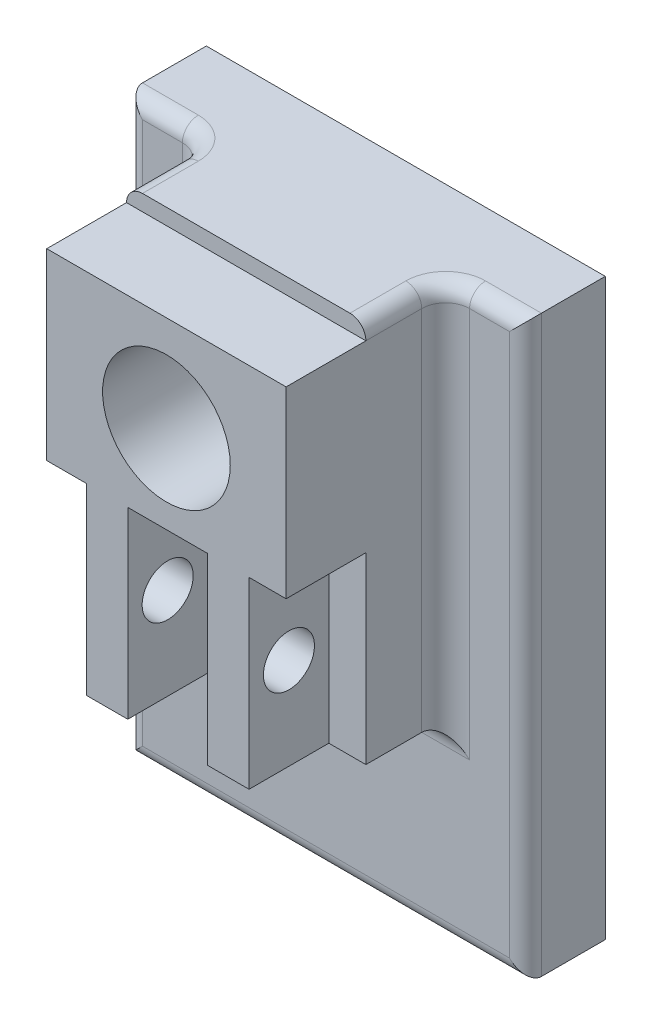
ISO-10303-21;
HEADER;
FILE_DESCRIPTION(('STEP AP214'),'2;1');
FILE_NAME('part.step','',(''),(''),'','','');
FILE_SCHEMA(('AUTOMOTIVE_DESIGN { 1 0 10303 214 1 1 1 1 }'));
ENDSEC;
DATA;
#1=APPLICATION_CONTEXT('core data for automotive mechanical design processes');
#2=APPLICATION_PROTOCOL_DEFINITION('international standard','automotive_design',2000,#1);
#3=PRODUCT_CONTEXT('',#1,'mechanical');
#4=PRODUCT('Part','Part','',(#3));
#5=PRODUCT_RELATED_PRODUCT_CATEGORY('part','',(#4));
#6=PRODUCT_DEFINITION_FORMATION('','',#4);
#7=PRODUCT_DEFINITION_CONTEXT('part definition',#1,'design');
#8=PRODUCT_DEFINITION('design','',#6,#7);
#9=PRODUCT_DEFINITION_SHAPE('','',#8);
#10=(LENGTH_UNIT() NAMED_UNIT(*) SI_UNIT(.MILLI.,.METRE.));
#11=(NAMED_UNIT(*) PLANE_ANGLE_UNIT() SI_UNIT($,.RADIAN.));
#12=(NAMED_UNIT(*) SI_UNIT($,.STERADIAN.) SOLID_ANGLE_UNIT());
#13=UNCERTAINTY_MEASURE_WITH_UNIT(LENGTH_MEASURE(1.E-05),#10,'distance_accuracy_value','');
#14=(GEOMETRIC_REPRESENTATION_CONTEXT(3) GLOBAL_UNCERTAINTY_ASSIGNED_CONTEXT((#13)) GLOBAL_UNIT_ASSIGNED_CONTEXT((#10,
#11,#12)) REPRESENTATION_CONTEXT('',''));
#15=CARTESIAN_POINT('',(0.,0.,0.));
#16=DIRECTION('',(0.,0.,1.));
#17=DIRECTION('',(1.,0.,0.));
#18=AXIS2_PLACEMENT_3D('',#15,#16,#17);
#19=CARTESIAN_POINT('',(-45.2947470817121,102.712840466926,50.));
#20=DIRECTION('',(0.,0.,1.));
#21=DIRECTION('',(1.,0.,0.));
#22=AXIS2_PLACEMENT_3D('',#19,#20,#21);
#23=PLANE('',#22);
#24=DIRECTION('',(1.,0.,0.));
#25=VECTOR('',#24,1.);
#26=CARTESIAN_POINT('',(-45.2947470817121,-17.2871595330739,50.));
#27=LINE('',#26,#25);
#28=CARTESIAN_POINT('',(-19.9070920345211,-17.2871595330739,50.));
#29=VERTEX_POINT('',#28);
#30=CARTESIAN_POINT('',(5.09290796547895,-17.2871595330739,50.));
#31=VERTEX_POINT('',#30);
#32=EDGE_CURVE('E238',#29,#31,#27,.T.);
#33=ORIENTED_EDGE('',*,*,#32,.T.);
#34=DIRECTION('',(0.,-1.,0.));
#35=VECTOR('',#34,1.);
#36=CARTESIAN_POINT('',(5.09290796547894,40.2128404669261,50.));
#37=LINE('',#36,#35);
#38=CARTESIAN_POINT('',(5.09290796547894,40.2128404669261,50.));
#39=VERTEX_POINT('',#38);
#40=EDGE_CURVE('E219',#39,#31,#37,.T.);
#41=ORIENTED_EDGE('',*,*,#40,.F.);
#42=DIRECTION('',(1.,0.,0.));
#43=VECTOR('',#42,1.);
#44=CARTESIAN_POINT('',(29.7052529182879,40.2128404669261,50.));
#45=LINE('',#44,#43);
#46=CARTESIAN_POINT('',(-19.9070920345211,40.2128404669261,50.));
#47=VERTEX_POINT('',#46);
#48=EDGE_CURVE('E467',#47,#39,#45,.T.);
#49=ORIENTED_EDGE('',*,*,#48,.F.);
#50=DIRECTION('',(0.,-1.,0.));
#51=VECTOR('',#50,1.);
#52=CARTESIAN_POINT('',(-19.9070920345211,40.2128404669261,50.));
#53=LINE('',#52,#51);
#54=EDGE_CURVE('E244',#47,#29,#53,.T.);
#55=ORIENTED_EDGE('',*,*,#54,.T.);
#56=EDGE_LOOP('',(#33,#41,#49,#55));
#57=FACE_BOUND('',#56,.T.);
#58=ADVANCED_FACE('F43',(#57),#23,.T.);
#59=CARTESIAN_POINT('',(29.7052529182879,40.2128404669261,75.));
#60=DIRECTION('',(0.,1.,0.));
#61=DIRECTION('',(-1.,0.,0.));
#62=AXIS2_PLACEMENT_3D('',#59,#60,#61);
#63=PLANE('',#62);
#64=DIRECTION('',(0.,0.,-1.));
#65=VECTOR('',#64,1.);
#66=CARTESIAN_POINT('',(5.09290796547894,40.2128404669261,75.));
#67=LINE('',#66,#65);
#68=CARTESIAN_POINT('',(5.09290796547894,40.2128404669261,75.));
#69=VERTEX_POINT('',#68);
#70=EDGE_CURVE('E225',#69,#39,#67,.T.);
#71=ORIENTED_EDGE('',*,*,#70,.F.);
#72=DIRECTION('',(1.,0.,0.));
#73=VECTOR('',#72,1.);
#74=CARTESIAN_POINT('',(29.7052529182879,40.2128404669261,75.));
#75=LINE('',#74,#73);
#76=CARTESIAN_POINT('',(-19.9070920345211,40.2128404669261,75.));
#77=VERTEX_POINT('',#76);
#78=EDGE_CURVE('E475',#77,#69,#75,.T.);
#79=ORIENTED_EDGE('',*,*,#78,.F.);
#80=DIRECTION('',(0.,0.,-1.));
#81=VECTOR('',#80,1.);
#82=CARTESIAN_POINT('',(-19.9070920345211,40.2128404669261,75.));
#83=LINE('',#82,#81);
#84=EDGE_CURVE('E498',#77,#47,#83,.T.);
#85=ORIENTED_EDGE('',*,*,#84,.T.);
#86=ORIENTED_EDGE('',*,*,#48,.T.);
#87=EDGE_LOOP('',(#71,#79,#85,#86));
#88=FACE_BOUND('',#87,.T.);
#89=ADVANCED_FACE('F569',(#88),#63,.F.);
#90=CARTESIAN_POINT('',(-45.2947470817121,-17.2871595330739,50.));
#91=VERTEX_POINT('',#90);
#92=CARTESIAN_POINT('',(-32.907092034521,-17.2871595330739,50.));
#93=VERTEX_POINT('',#92);
#94=EDGE_CURVE('E246',#91,#93,#27,.T.);
#95=ORIENTED_EDGE('',*,*,#94,.T.);
#96=DIRECTION('',(0.,-1.,0.));
#97=VECTOR('',#96,1.);
#98=CARTESIAN_POINT('',(-32.907092034521,40.2128404669261,50.));
#99=LINE('',#98,#97);
#100=CARTESIAN_POINT('',(-32.907092034521,40.2128404669261,50.));
#101=VERTEX_POINT('',#100);
#102=EDGE_CURVE('E507',#101,#93,#99,.T.);
#103=ORIENTED_EDGE('',*,*,#102,.F.);
#104=CARTESIAN_POINT('',(-45.2947470817121,40.2128404669261,50.));
#105=VERTEX_POINT('',#104);
#106=EDGE_CURVE('E462',#105,#101,#45,.T.);
#107=ORIENTED_EDGE('',*,*,#106,.F.);
#108=DIRECTION('',(0.,-1.,0.));
#109=VECTOR('',#108,1.);
#110=CARTESIAN_POINT('',(-45.2947470817121,102.712840466926,50.));
#111=LINE('',#110,#109);
#112=EDGE_CURVE('E253',#105,#91,#111,.T.);
#113=ORIENTED_EDGE('',*,*,#112,.T.);
#114=EDGE_LOOP('',(#95,#103,#107,#113));
#115=FACE_BOUND('',#114,.T.);
#116=ADVANCED_FACE('F571',(#115),#23,.T.);
#117=DIRECTION('',(0.,0.,-1.));
#118=VECTOR('',#117,1.);
#119=CARTESIAN_POINT('',(-32.907092034521,40.2128404669261,75.));
#120=LINE('',#119,#118);
#121=CARTESIAN_POINT('',(-32.907092034521,40.2128404669261,75.));
#122=VERTEX_POINT('',#121);
#123=EDGE_CURVE('E495',#122,#101,#120,.T.);
#124=ORIENTED_EDGE('',*,*,#123,.F.);
#125=CARTESIAN_POINT('',(-45.2947470817121,40.2128404669261,75.));
#126=VERTEX_POINT('',#125);
#127=EDGE_CURVE('E461',#126,#122,#75,.T.);
#128=ORIENTED_EDGE('',*,*,#127,.F.);
#129=DIRECTION('',(0.,0.,-1.));
#130=VECTOR('',#129,1.);
#131=CARTESIAN_POINT('',(-45.2947470817121,40.2128404669261,75.));
#132=LINE('',#131,#130);
#133=EDGE_CURVE('E451',#126,#105,#132,.T.);
#134=ORIENTED_EDGE('',*,*,#133,.T.);
#135=ORIENTED_EDGE('',*,*,#106,.T.);
#136=EDGE_LOOP('',(#124,#128,#134,#135));
#137=FACE_BOUND('',#136,.T.);
#138=ADVANCED_FACE('F578',(#137),#63,.F.);
#139=DIRECTION('',(0.,-1.,0.));
#140=VECTOR('',#139,1.);
#141=CARTESIAN_POINT('',(18.0929079654789,40.2128404669261,50.));
#142=LINE('',#141,#140);
#143=CARTESIAN_POINT('',(18.0929079654789,40.2128404669261,50.));
#144=VERTEX_POINT('',#143);
#145=CARTESIAN_POINT('',(18.0929079654789,-17.2871595330739,50.));
#146=VERTEX_POINT('',#145);
#147=EDGE_CURVE('E231',#144,#146,#142,.T.);
#148=ORIENTED_EDGE('',*,*,#147,.T.);
#149=CARTESIAN_POINT('',(29.7052529182879,-17.2871595330739,50.));
#150=VERTEX_POINT('',#149);
#151=EDGE_CURVE('E247',#146,#150,#27,.T.);
#152=ORIENTED_EDGE('',*,*,#151,.T.);
#153=DIRECTION('',(0.,1.,0.));
#154=VECTOR('',#153,1.);
#155=CARTESIAN_POINT('',(29.7052529182879,102.712840466926,50.));
#156=LINE('',#155,#154);
#157=CARTESIAN_POINT('',(29.7052529182879,40.2128404669261,50.));
#158=VERTEX_POINT('',#157);
#159=EDGE_CURVE('E252',#150,#158,#156,.T.);
#160=ORIENTED_EDGE('',*,*,#159,.T.);
#161=EDGE_CURVE('E468',#144,#158,#45,.T.);
#162=ORIENTED_EDGE('',*,*,#161,.F.);
#163=EDGE_LOOP('',(#148,#152,#160,#162));
#164=FACE_BOUND('',#163,.T.);
#165=ADVANCED_FACE('F584',(#164),#23,.T.);
#166=CARTESIAN_POINT('',(-70.2947470817121,102.712840466926,25.));
#167=DIRECTION('',(1.,0.,0.));
#168=DIRECTION('',(0.,1.,0.));
#169=AXIS2_PLACEMENT_3D('',#166,#167,#168);
#170=PLANE('',#169);
#171=DIRECTION('',(0.,0.,-1.));
#172=VECTOR('',#171,1.);
#173=CARTESIAN_POINT('',(-70.294747081712,-77.2871595330739,25.));
#174=LINE('',#173,#172);
#175=CARTESIAN_POINT('',(-70.294747081712,-77.2871595330739,20.));
#176=VERTEX_POINT('',#175);
#177=CARTESIAN_POINT('',(-70.294747081712,-77.2871595330739,0.));
#178=VERTEX_POINT('',#177);
#179=EDGE_CURVE('E296',#176,#178,#174,.T.);
#180=ORIENTED_EDGE('',*,*,#179,.F.);
#181=DIRECTION('',(0.,-1.,0.));
#182=VECTOR('',#181,1.);
#183=CARTESIAN_POINT('',(-70.2947470817121,102.712840466926,20.));
#184=LINE('',#183,#182);
#185=CARTESIAN_POINT('',(-70.2947470817121,102.712840466926,20.));
#186=VERTEX_POINT('',#185);
#187=EDGE_CURVE('E382',#176,#186,#184,.F.);
#188=ORIENTED_EDGE('',*,*,#187,.T.);
#189=DIRECTION('',(0.,0.,-1.));
#190=VECTOR('',#189,1.);
#191=CARTESIAN_POINT('',(-70.2947470817121,102.712840466926,25.));
#192=LINE('',#191,#190);
#193=CARTESIAN_POINT('',(-70.2947470817121,102.712840466926,0.));
#194=VERTEX_POINT('',#193);
#195=EDGE_CURVE('E287',#186,#194,#192,.T.);
#196=ORIENTED_EDGE('',*,*,#195,.T.);
#197=DIRECTION('',(0.,-1.,0.));
#198=VECTOR('',#197,1.);
#199=CARTESIAN_POINT('',(-70.2947470817121,102.712840466926,0.));
#200=LINE('',#199,#198);
#201=EDGE_CURVE('E271',#194,#178,#200,.T.);
#202=ORIENTED_EDGE('',*,*,#201,.T.);
#203=EDGE_LOOP('',(#180,#188,#196,#202));
#204=FACE_BOUND('',#203,.T.);
#205=ADVANCED_FACE('F596',(#204),#170,.F.);
#206=CARTESIAN_POINT('',(-70.294747081712,-77.2871595330739,25.));
#207=DIRECTION('',(0.,1.,0.));
#208=DIRECTION('',(-1.,0.,0.));
#209=AXIS2_PLACEMENT_3D('',#206,#207,#208);
#210=PLANE('',#209);
#211=DIRECTION('',(0.,0.,-1.));
#212=VECTOR('',#211,1.);
#213=CARTESIAN_POINT('',(54.705252918288,-77.2871595330739,25.));
#214=LINE('',#213,#212);
#215=CARTESIAN_POINT('',(54.705252918288,-77.2871595330739,20.));
#216=VERTEX_POINT('',#215);
#217=CARTESIAN_POINT('',(54.705252918288,-77.2871595330739,0.));
#218=VERTEX_POINT('',#217);
#219=EDGE_CURVE('E293',#216,#218,#214,.T.);
#220=ORIENTED_EDGE('',*,*,#219,.F.);
#221=DIRECTION('',(1.,0.,0.));
#222=VECTOR('',#221,1.);
#223=CARTESIAN_POINT('',(-70.294747081712,-77.2871595330739,20.));
#224=LINE('',#223,#222);
#225=EDGE_CURVE('E53',#216,#176,#224,.F.);
#226=ORIENTED_EDGE('',*,*,#225,.T.);
#227=ORIENTED_EDGE('',*,*,#179,.T.);
#228=DIRECTION('',(1.,0.,0.));
#229=VECTOR('',#228,1.);
#230=CARTESIAN_POINT('',(-70.294747081712,-77.2871595330739,0.));
#231=LINE('',#230,#229);
#232=EDGE_CURVE('E275',#178,#218,#231,.T.);
#233=ORIENTED_EDGE('',*,*,#232,.T.);
#234=EDGE_LOOP('',(#220,#226,#227,#233));
#235=FACE_BOUND('',#234,.T.);
#236=ADVANCED_FACE('F603',(#235),#210,.F.);
#237=CARTESIAN_POINT('',(54.7052529182879,102.712840466926,25.));
#238=DIRECTION('',(-1.,0.,0.));
#239=DIRECTION('',(0.,-1.,0.));
#240=AXIS2_PLACEMENT_3D('',#237,#238,#239);
#241=PLANE('',#240);
#242=DIRECTION('',(0.,0.,-1.));
#243=VECTOR('',#242,1.);
#244=CARTESIAN_POINT('',(54.7052529182879,102.712840466926,25.));
#245=LINE('',#244,#243);
#246=CARTESIAN_POINT('',(54.7052529182879,102.712840466926,20.));
#247=VERTEX_POINT('',#246);
#248=CARTESIAN_POINT('',(54.7052529182879,102.712840466926,0.));
#249=VERTEX_POINT('',#248);
#250=EDGE_CURVE('E290',#247,#249,#245,.T.);
#251=ORIENTED_EDGE('',*,*,#250,.F.);
#252=DIRECTION('',(0.,1.,0.));
#253=VECTOR('',#252,1.);
#254=CARTESIAN_POINT('',(54.705252918288,-77.2871595330739,20.));
#255=LINE('',#254,#253);
#256=EDGE_CURVE('E11',#247,#216,#255,.F.);
#257=ORIENTED_EDGE('',*,*,#256,.T.);
#258=ORIENTED_EDGE('',*,*,#219,.T.);
#259=DIRECTION('',(0.,1.,0.));
#260=VECTOR('',#259,1.);
#261=CARTESIAN_POINT('',(54.7052529182879,102.712840466926,0.));
#262=LINE('',#261,#260);
#263=EDGE_CURVE('E279',#218,#249,#262,.T.);
#264=ORIENTED_EDGE('',*,*,#263,.T.);
#265=EDGE_LOOP('',(#251,#257,#258,#264));
#266=FACE_BOUND('',#265,.T.);
#267=ADVANCED_FACE('F662',(#266),#241,.F.);
#268=CARTESIAN_POINT('',(-70.2947470817121,102.712840466926,25.));
#269=DIRECTION('',(0.,-1.,0.));
#270=DIRECTION('',(1.,0.,0.));
#271=AXIS2_PLACEMENT_3D('',#268,#269,#270);
#272=PLANE('',#271);
#273=DIRECTION('',(-1.,0.,0.));
#274=VECTOR('',#273,1.);
#275=CARTESIAN_POINT('',(-45.2947470817121,102.712840466926,50.));
#276=LINE('',#275,#274);
#277=CARTESIAN_POINT('',(24.7052529182879,102.712840466926,50.));
#278=VERTEX_POINT('',#277);
#279=CARTESIAN_POINT('',(-40.2947470817121,102.712840466926,50.));
#280=VERTEX_POINT('',#279);
#281=EDGE_CURVE('E260',#278,#280,#276,.T.);
#282=ORIENTED_EDGE('',*,*,#281,.F.);
#283=DIRECTION('',(0.,0.,-1.));
#284=VECTOR('',#283,1.);
#285=CARTESIAN_POINT('',(24.7052529182879,102.712840466926,25.));
#286=LINE('',#285,#284);
#287=CARTESIAN_POINT('',(24.7052529182879,102.712840466926,32.5));
#288=VERTEX_POINT('',#287);
#289=EDGE_CURVE('E343',#278,#288,#286,.T.);
#290=ORIENTED_EDGE('',*,*,#289,.T.);
#291=CARTESIAN_POINT('',(37.2052529182879,102.712840466926,32.5));
#292=DIRECTION('',(0.,-1.,0.));
#293=DIRECTION('',(1.,0.,0.));
#294=AXIS2_PLACEMENT_3D('',#291,#292,#293);
#295=CIRCLE('',#294,12.5);
#296=CARTESIAN_POINT('',(37.2052529182879,102.712840466926,20.));
#297=VERTEX_POINT('',#296);
#298=EDGE_CURVE('E340',#288,#297,#295,.T.);
#299=ORIENTED_EDGE('',*,*,#298,.T.);
#300=DIRECTION('',(-1.,0.,0.));
#301=VECTOR('',#300,1.);
#302=CARTESIAN_POINT('',(54.7052529182879,102.712840466926,20.));
#303=LINE('',#302,#301);
#304=EDGE_CURVE('E337',#297,#247,#303,.F.);
#305=ORIENTED_EDGE('',*,*,#304,.T.);
#306=ORIENTED_EDGE('',*,*,#250,.T.);
#307=DIRECTION('',(-1.,0.,0.));
#308=VECTOR('',#307,1.);
#309=CARTESIAN_POINT('',(-70.2947470817121,102.712840466926,0.));
#310=LINE('',#309,#308);
#311=EDGE_CURVE('E283',#249,#194,#310,.T.);
#312=ORIENTED_EDGE('',*,*,#311,.T.);
#313=ORIENTED_EDGE('',*,*,#195,.F.);
#314=DIRECTION('',(-1.,0.,0.));
#315=VECTOR('',#314,1.);
#316=CARTESIAN_POINT('',(-52.7947470817121,102.712840466926,20.));
#317=LINE('',#316,#315);
#318=CARTESIAN_POINT('',(-52.7947470817121,102.712840466926,20.));
#319=VERTEX_POINT('',#318);
#320=EDGE_CURVE('E320',#186,#319,#317,.F.);
#321=ORIENTED_EDGE('',*,*,#320,.T.);
#322=CARTESIAN_POINT('',(-52.7947470817121,102.712840466926,32.5));
#323=DIRECTION('',(0.,-1.,0.));
#324=DIRECTION('',(1.,0.,0.));
#325=AXIS2_PLACEMENT_3D('',#322,#323,#324);
#326=CIRCLE('',#325,12.5);
#327=CARTESIAN_POINT('',(-40.2947470817121,102.712840466926,32.5));
#328=VERTEX_POINT('',#327);
#329=EDGE_CURVE('E331',#319,#328,#326,.T.);
#330=ORIENTED_EDGE('',*,*,#329,.T.);
#331=DIRECTION('',(0.,0.,-1.));
#332=VECTOR('',#331,1.);
#333=CARTESIAN_POINT('',(-40.2947470817121,102.712840466926,25.));
#334=LINE('',#333,#332);
#335=EDGE_CURVE('E334',#328,#280,#334,.F.);
#336=ORIENTED_EDGE('',*,*,#335,.T.);
#337=EDGE_LOOP('',(#282,#290,#299,#305,#306,#312,#313,#321,#330,#336));
#338=FACE_BOUND('',#337,.T.);
#339=ADVANCED_FACE('F427',(#338),#272,.F.);
#340=CARTESIAN_POINT('',(-70.294747081712,-77.2871595330739,25.));
#341=DIRECTION('',(0.,0.,1.));
#342=DIRECTION('',(1.,0.,0.));
#343=AXIS2_PLACEMENT_3D('',#340,#341,#342);
#344=PLANE('',#343);
#345=DIRECTION('',(0.,1.,0.));
#346=VECTOR('',#345,1.);
#347=CARTESIAN_POINT('',(49.7052529182879,102.712840466926,25.));
#348=LINE('',#347,#346);
#349=CARTESIAN_POINT('',(49.705252918288,-72.2871595330739,25.));
#350=VERTEX_POINT('',#349);
#351=CARTESIAN_POINT('',(49.7052529182879,97.7128404669261,25.));
#352=VERTEX_POINT('',#351);
#353=EDGE_CURVE('E376',#350,#352,#348,.T.);
#354=ORIENTED_EDGE('',*,*,#353,.T.);
#355=DIRECTION('',(-1.,0.,0.));
#356=VECTOR('',#355,1.);
#357=CARTESIAN_POINT('',(37.2052529182879,97.7128404669261,25.));
#358=LINE('',#357,#356);
#359=CARTESIAN_POINT('',(37.2052529182879,97.7128404669261,25.));
#360=VERTEX_POINT('',#359);
#361=EDGE_CURVE('E379',#352,#360,#358,.T.);
#362=ORIENTED_EDGE('',*,*,#361,.T.);
#363=DIRECTION('',(0.,1.,0.));
#364=VECTOR('',#363,1.);
#365=CARTESIAN_POINT('',(37.2052529182879,-77.2871595330739,25.));
#366=LINE('',#365,#364);
#367=CARTESIAN_POINT('',(37.2052529182879,-24.7871595330739,25.));
#368=VERTEX_POINT('',#367);
#369=EDGE_CURVE('E310',#360,#368,#366,.F.);
#370=ORIENTED_EDGE('',*,*,#369,.T.);
#371=DIRECTION('',(1.,0.,0.));
#372=VECTOR('',#371,1.);
#373=CARTESIAN_POINT('',(-70.294747081712,-24.7871595330739,25.));
#374=LINE('',#373,#372);
#375=CARTESIAN_POINT('',(-52.7947470817121,-24.7871595330739,25.));
#376=VERTEX_POINT('',#375);
#377=EDGE_CURVE('E307',#368,#376,#374,.F.);
#378=ORIENTED_EDGE('',*,*,#377,.T.);
#379=DIRECTION('',(0.,-1.,0.));
#380=VECTOR('',#379,1.);
#381=CARTESIAN_POINT('',(-52.7947470817121,-77.2871595330739,25.));
#382=LINE('',#381,#380);
#383=CARTESIAN_POINT('',(-52.7947470817121,97.7128404669261,25.));
#384=VERTEX_POINT('',#383);
#385=EDGE_CURVE('E303',#376,#384,#382,.F.);
#386=ORIENTED_EDGE('',*,*,#385,.T.);
#387=DIRECTION('',(-1.,0.,0.));
#388=VECTOR('',#387,1.);
#389=CARTESIAN_POINT('',(-70.2947470817121,97.7128404669261,25.));
#390=LINE('',#389,#388);
#391=CARTESIAN_POINT('',(-65.2947470817121,97.7128404669261,25.));
#392=VERTEX_POINT('',#391);
#393=EDGE_CURVE('E367',#384,#392,#390,.T.);
#394=ORIENTED_EDGE('',*,*,#393,.T.);
#395=DIRECTION('',(0.,-1.,0.));
#396=VECTOR('',#395,1.);
#397=CARTESIAN_POINT('',(-65.294747081712,-77.2871595330739,25.));
#398=LINE('',#397,#396);
#399=CARTESIAN_POINT('',(-65.294747081712,-72.2871595330739,25.));
#400=VERTEX_POINT('',#399);
#401=EDGE_CURVE('E370',#392,#400,#398,.T.);
#402=ORIENTED_EDGE('',*,*,#401,.T.);
#403=DIRECTION('',(1.,0.,0.));
#404=VECTOR('',#403,1.);
#405=CARTESIAN_POINT('',(54.705252918288,-72.2871595330739,25.));
#406=LINE('',#405,#404);
#407=EDGE_CURVE('E373',#400,#350,#406,.T.);
#408=ORIENTED_EDGE('',*,*,#407,.T.);
#409=EDGE_LOOP('',(#354,#362,#370,#378,#386,#394,#402,#408));
#410=FACE_BOUND('',#409,.T.);
#411=ADVANCED_FACE('F685',(#410),#344,.T.);
#412=CARTESIAN_POINT('',(-70.294747081712,-77.2871595330739,0.));
#413=DIRECTION('',(0.,0.,1.));
#414=DIRECTION('',(1.,0.,0.));
#415=AXIS2_PLACEMENT_3D('',#412,#413,#414);
#416=PLANE('',#415);
#417=CARTESIAN_POINT('',(-7.79474708171207,67.7128404669261,0.));
#418=DIRECTION('',(0.,0.,1.));
#419=DIRECTION('',(1.,0.,0.));
#420=AXIS2_PLACEMENT_3D('',#417,#418,#419);
#421=CIRCLE('',#420,20.);
#422=CARTESIAN_POINT('',(12.2052529182879,67.7128404669261,0.));
#423=VERTEX_POINT('',#422);
#424=EDGE_CURVE('E471',#423,#423,#421,.T.);
#425=ORIENTED_EDGE('',*,*,#424,.T.);
#426=EDGE_LOOP('',(#425));
#427=FACE_BOUND('',#426,.T.);
#428=ORIENTED_EDGE('',*,*,#201,.F.);
#429=ORIENTED_EDGE('',*,*,#311,.F.);
#430=ORIENTED_EDGE('',*,*,#263,.F.);
#431=ORIENTED_EDGE('',*,*,#232,.F.);
#432=EDGE_LOOP('',(#428,#429,#430,#431));
#433=FACE_BOUND('',#432,.T.);
#434=ADVANCED_FACE('F687',(#427,#433),#416,.F.);
#435=CARTESIAN_POINT('',(-45.2947470817121,102.712840466926,50.));
#436=DIRECTION('',(1.,0.,0.));
#437=DIRECTION('',(0.,1.,0.));
#438=AXIS2_PLACEMENT_3D('',#435,#436,#437);
#439=PLANE('',#438);
#440=ORIENTED_EDGE('',*,*,#112,.F.);
#441=ORIENTED_EDGE('',*,*,#133,.F.);
#442=DIRECTION('',(0.,-1.,0.));
#443=VECTOR('',#442,1.);
#444=CARTESIAN_POINT('',(-45.2947470817121,40.2128404669261,75.));
#445=LINE('',#444,#443);
#446=CARTESIAN_POINT('',(-45.2947470817121,97.7128404669261,75.));
#447=VERTEX_POINT('',#446);
#448=EDGE_CURVE('E477',#447,#126,#445,.T.);
#449=ORIENTED_EDGE('',*,*,#448,.F.);
#450=DIRECTION('',(0.,0.,-1.));
#451=VECTOR('',#450,1.);
#452=CARTESIAN_POINT('',(-45.2947470817121,97.7128404669261,75.));
#453=LINE('',#452,#451);
#454=CARTESIAN_POINT('',(-45.2947470817121,97.7128404669261,50.));
#455=VERTEX_POINT('',#454);
#456=EDGE_CURVE('E449',#447,#455,#453,.T.);
#457=ORIENTED_EDGE('',*,*,#456,.T.);
#458=DIRECTION('',(0.,0.,-1.));
#459=VECTOR('',#458,1.);
#460=CARTESIAN_POINT('',(-45.2947470817121,97.7128404669261,50.));
#461=LINE('',#460,#459);
#462=CARTESIAN_POINT('',(-45.2947470817121,97.7128404669261,32.5));
#463=VERTEX_POINT('',#462);
#464=EDGE_CURVE('E358',#455,#463,#461,.T.);
#465=ORIENTED_EDGE('',*,*,#464,.T.);
#466=DIRECTION('',(0.,-1.,0.));
#467=VECTOR('',#466,1.);
#468=CARTESIAN_POINT('',(-45.2947470817121,102.712840466926,32.5));
#469=LINE('',#468,#467);
#470=CARTESIAN_POINT('',(-45.2947470817121,-17.2871595330739,32.5));
#471=VERTEX_POINT('',#470);
#472=EDGE_CURVE('E317',#463,#471,#469,.T.);
#473=ORIENTED_EDGE('',*,*,#472,.T.);
#474=DIRECTION('',(0.,0.,-1.));
#475=VECTOR('',#474,1.);
#476=CARTESIAN_POINT('',(-45.2947470817121,-17.2871595330739,50.));
#477=LINE('',#476,#475);
#478=EDGE_CURVE('E268',#91,#471,#477,.T.);
#479=ORIENTED_EDGE('',*,*,#478,.F.);
#480=EDGE_LOOP('',(#440,#441,#449,#457,#465,#473,#479));
#481=FACE_BOUND('',#480,.T.);
#482=ADVANCED_FACE('F633',(#481),#439,.F.);
#483=CARTESIAN_POINT('',(-45.2947470817121,-17.2871595330739,50.));
#484=DIRECTION('',(0.,1.,0.));
#485=DIRECTION('',(-1.,0.,0.));
#486=AXIS2_PLACEMENT_3D('',#483,#484,#485);
#487=PLANE('',#486);
#488=ORIENTED_EDGE('',*,*,#478,.T.);
#489=DIRECTION('',(1.,0.,0.));
#490=VECTOR('',#489,1.);
#491=CARTESIAN_POINT('',(-45.2947470817121,-17.2871595330739,32.5));
#492=LINE('',#491,#490);
#493=CARTESIAN_POINT('',(29.7052529182879,-17.2871595330739,32.5));
#494=VERTEX_POINT('',#493);
#495=EDGE_CURVE('E299',#471,#494,#492,.T.);
#496=ORIENTED_EDGE('',*,*,#495,.T.);
#497=DIRECTION('',(0.,0.,-1.));
#498=VECTOR('',#497,1.);
#499=CARTESIAN_POINT('',(29.7052529182879,-17.2871595330739,50.));
#500=LINE('',#499,#498);
#501=EDGE_CURVE('E264',#150,#494,#500,.T.);
#502=ORIENTED_EDGE('',*,*,#501,.F.);
#503=ORIENTED_EDGE('',*,*,#151,.F.);
#504=DIRECTION('',(0.,0.,-1.));
#505=VECTOR('',#504,1.);
#506=CARTESIAN_POINT('',(18.0929079654789,-17.2871595330739,75.));
#507=LINE('',#506,#505);
#508=CARTESIAN_POINT('',(18.0929079654789,-17.2871595330739,75.));
#509=VERTEX_POINT('',#508);
#510=EDGE_CURVE('E534',#509,#146,#507,.T.);
#511=ORIENTED_EDGE('',*,*,#510,.F.);
#512=DIRECTION('',(1.,0.,0.));
#513=VECTOR('',#512,1.);
#514=CARTESIAN_POINT('',(5.09290796547895,-17.2871595330739,75.));
#515=LINE('',#514,#513);
#516=CARTESIAN_POINT('',(5.09290796547895,-17.2871595330739,75.));
#517=VERTEX_POINT('',#516);
#518=EDGE_CURVE('E232',#517,#509,#515,.T.);
#519=ORIENTED_EDGE('',*,*,#518,.F.);
#520=DIRECTION('',(0.,0.,-1.));
#521=VECTOR('',#520,1.);
#522=CARTESIAN_POINT('',(5.09290796547895,-17.2871595330739,75.));
#523=LINE('',#522,#521);
#524=EDGE_CURVE('E222',#517,#31,#523,.T.);
#525=ORIENTED_EDGE('',*,*,#524,.T.);
#526=ORIENTED_EDGE('',*,*,#32,.F.);
#527=DIRECTION('',(0.,0.,-1.));
#528=VECTOR('',#527,1.);
#529=CARTESIAN_POINT('',(-19.9070920345211,-17.2871595330739,75.));
#530=LINE('',#529,#528);
#531=CARTESIAN_POINT('',(-19.9070920345211,-17.2871595330739,75.));
#532=VERTEX_POINT('',#531);
#533=EDGE_CURVE('E491',#532,#29,#530,.T.);
#534=ORIENTED_EDGE('',*,*,#533,.F.);
#535=DIRECTION('',(-1.,0.,0.));
#536=VECTOR('',#535,1.);
#537=CARTESIAN_POINT('',(-19.9070920345211,-17.2871595330739,75.));
#538=LINE('',#537,#536);
#539=CARTESIAN_POINT('',(-32.907092034521,-17.2871595330739,75.));
#540=VERTEX_POINT('',#539);
#541=EDGE_CURVE('E506',#532,#540,#538,.T.);
#542=ORIENTED_EDGE('',*,*,#541,.T.);
#543=DIRECTION('',(0.,0.,-1.));
#544=VECTOR('',#543,1.);
#545=CARTESIAN_POINT('',(-32.907092034521,-17.2871595330739,75.));
#546=LINE('',#545,#544);
#547=EDGE_CURVE('E492',#540,#93,#546,.T.);
#548=ORIENTED_EDGE('',*,*,#547,.T.);
#549=ORIENTED_EDGE('',*,*,#94,.F.);
#550=EDGE_LOOP('',(#488,#496,#502,#503,#511,#519,#525,#526,#534,#542,#548,#549));
#551=FACE_BOUND('',#550,.T.);
#552=ADVANCED_FACE('F237',(#551),#487,.F.);
#553=CARTESIAN_POINT('',(29.7052529182879,102.712840466926,50.));
#554=DIRECTION('',(-1.,0.,0.));
#555=DIRECTION('',(0.,-1.,0.));
#556=AXIS2_PLACEMENT_3D('',#553,#554,#555);
#557=PLANE('',#556);
#558=DIRECTION('',(0.,1.,0.));
#559=VECTOR('',#558,1.);
#560=CARTESIAN_POINT('',(29.7052529182879,102.712840466926,32.5));
#561=LINE('',#560,#559);
#562=CARTESIAN_POINT('',(29.7052529182879,97.7128404669261,32.5));
#563=VERTEX_POINT('',#562);
#564=EDGE_CURVE('E313',#494,#563,#561,.T.);
#565=ORIENTED_EDGE('',*,*,#564,.T.);
#566=DIRECTION('',(0.,0.,-1.));
#567=VECTOR('',#566,1.);
#568=CARTESIAN_POINT('',(29.7052529182879,97.7128404669261,50.));
#569=LINE('',#568,#567);
#570=CARTESIAN_POINT('',(29.7052529182879,97.7128404669261,50.));
#571=VERTEX_POINT('',#570);
#572=EDGE_CURVE('E347',#563,#571,#569,.F.);
#573=ORIENTED_EDGE('',*,*,#572,.T.);
#574=DIRECTION('',(0.,0.,-1.));
#575=VECTOR('',#574,1.);
#576=CARTESIAN_POINT('',(29.7052529182879,97.7128404669261,75.));
#577=LINE('',#576,#575);
#578=CARTESIAN_POINT('',(29.7052529182879,97.7128404669261,75.));
#579=VERTEX_POINT('',#578);
#580=EDGE_CURVE('E391',#579,#571,#577,.T.);
#581=ORIENTED_EDGE('',*,*,#580,.F.);
#582=DIRECTION('',(0.,1.,0.));
#583=VECTOR('',#582,1.);
#584=CARTESIAN_POINT('',(29.7052529182879,40.2128404669261,75.));
#585=LINE('',#584,#583);
#586=CARTESIAN_POINT('',(29.7052529182879,40.2128404669261,75.));
#587=VERTEX_POINT('',#586);
#588=EDGE_CURVE('E466',#587,#579,#585,.T.);
#589=ORIENTED_EDGE('',*,*,#588,.F.);
#590=DIRECTION('',(0.,0.,-1.));
#591=VECTOR('',#590,1.);
#592=CARTESIAN_POINT('',(29.7052529182879,40.2128404669261,75.));
#593=LINE('',#592,#591);
#594=EDGE_CURVE('E457',#587,#158,#593,.T.);
#595=ORIENTED_EDGE('',*,*,#594,.T.);
#596=ORIENTED_EDGE('',*,*,#159,.F.);
#597=ORIENTED_EDGE('',*,*,#501,.T.);
#598=EDGE_LOOP('',(#565,#573,#581,#589,#595,#596,#597));
#599=FACE_BOUND('',#598,.T.);
#600=ADVANCED_FACE('F587',(#599),#557,.F.);
#601=DIRECTION('',(-1.,0.,0.));
#602=VECTOR('',#601,1.);
#603=CARTESIAN_POINT('',(29.7052529182879,97.7128404669261,50.));
#604=LINE('',#603,#602);
#605=EDGE_CURVE('E433',#571,#455,#604,.T.);
#606=ORIENTED_EDGE('',*,*,#605,.F.);
#607=CARTESIAN_POINT('',(24.7052529182879,97.7128404669261,50.));
#608=DIRECTION('',(0.,0.,1.));
#609=DIRECTION('',(1.,0.,0.));
#610=AXIS2_PLACEMENT_3D('',#607,#608,#609);
#611=CIRCLE('',#610,5.);
#612=EDGE_CURVE('E355',#571,#278,#611,.T.);
#613=ORIENTED_EDGE('',*,*,#612,.T.);
#614=ORIENTED_EDGE('',*,*,#281,.T.);
#615=CARTESIAN_POINT('',(-40.2947470817121,97.7128404669261,50.));
#616=DIRECTION('',(0.,0.,1.));
#617=DIRECTION('',(1.,0.,0.));
#618=AXIS2_PLACEMENT_3D('',#615,#616,#617);
#619=CIRCLE('',#618,5.);
#620=EDGE_CURVE('E351',#280,#455,#619,.T.);
#621=ORIENTED_EDGE('',*,*,#620,.T.);
#622=EDGE_LOOP('',(#606,#613,#614,#621));
#623=FACE_BOUND('',#622,.T.);
#624=ADVANCED_FACE('F430',(#623),#23,.T.);
#625=CARTESIAN_POINT('',(-52.7947470817121,102.712840466926,32.5));
#626=DIRECTION('',(0.,-1.,0.));
#627=DIRECTION('',(1.,0.,0.));
#628=AXIS2_PLACEMENT_3D('',#625,#626,#627);
#629=CYLINDRICAL_SURFACE('',#628,7.5);
#630=ORIENTED_EDGE('',*,*,#472,.F.);
#631=CARTESIAN_POINT('',(-52.7947470817121,97.7128404669261,32.5));
#632=DIRECTION('',(0.,-1.,0.));
#633=DIRECTION('',(1.,0.,0.));
#634=AXIS2_PLACEMENT_3D('',#631,#632,#633);
#635=CIRCLE('',#634,7.5);
#636=EDGE_CURVE('E364',#463,#384,#635,.F.);
#637=ORIENTED_EDGE('',*,*,#636,.T.);
#638=ORIENTED_EDGE('',*,*,#385,.F.);
#639=CARTESIAN_POINT('',(-52.7947470817121,-24.7871595330739,32.5));
#640=DIRECTION('',(0.707106781186547,-0.707106781186548,0.));
#641=DIRECTION('',(-0.707106781186548,-0.707106781186547,0.));
#642=AXIS2_PLACEMENT_3D('',#639,#640,#641);
#643=ELLIPSE('',#642,10.6066017177982,7.5);
#644=EDGE_CURVE('E324',#471,#376,#643,.F.);
#645=ORIENTED_EDGE('',*,*,#644,.F.);
#646=EDGE_LOOP('',(#630,#637,#638,#645));
#647=FACE_BOUND('',#646,.T.);
#648=ADVANCED_FACE('F586',(#647),#629,.F.);
#649=CARTESIAN_POINT('',(37.2052529182879,102.712840466926,32.5));
#650=DIRECTION('',(0.,1.,0.));
#651=DIRECTION('',(-1.,0.,0.));
#652=AXIS2_PLACEMENT_3D('',#649,#650,#651);
#653=CYLINDRICAL_SURFACE('',#652,7.5);
#654=ORIENTED_EDGE('',*,*,#369,.F.);
#655=CARTESIAN_POINT('',(37.2052529182879,97.7128404669261,32.5));
#656=DIRECTION('',(0.,-1.,0.));
#657=DIRECTION('',(1.,0.,0.));
#658=AXIS2_PLACEMENT_3D('',#655,#656,#657);
#659=CIRCLE('',#658,7.5);
#660=EDGE_CURVE('E361',#360,#563,#659,.F.);
#661=ORIENTED_EDGE('',*,*,#660,.T.);
#662=ORIENTED_EDGE('',*,*,#564,.F.);
#663=CARTESIAN_POINT('',(37.2052529182879,-24.7871595330739,32.5));
#664=DIRECTION('',(0.707106781186548,0.707106781186547,0.));
#665=DIRECTION('',(-0.707106781186547,0.707106781186548,0.));
#666=AXIS2_PLACEMENT_3D('',#663,#664,#665);
#667=ELLIPSE('',#666,10.6066017177982,7.5);
#668=EDGE_CURVE('E321',#368,#494,#667,.T.);
#669=ORIENTED_EDGE('',*,*,#668,.F.);
#670=EDGE_LOOP('',(#654,#661,#662,#669));
#671=FACE_BOUND('',#670,.T.);
#672=ADVANCED_FACE('F592',(#671),#653,.F.);
#673=CARTESIAN_POINT('',(-45.2947470817121,-24.7871595330739,32.5));
#674=DIRECTION('',(1.,0.,0.));
#675=DIRECTION('',(0.,1.,0.));
#676=AXIS2_PLACEMENT_3D('',#673,#674,#675);
#677=CYLINDRICAL_SURFACE('',#676,7.5);
#678=ORIENTED_EDGE('',*,*,#644,.T.);
#679=ORIENTED_EDGE('',*,*,#377,.F.);
#680=ORIENTED_EDGE('',*,*,#668,.T.);
#681=ORIENTED_EDGE('',*,*,#495,.F.);
#682=EDGE_LOOP('',(#678,#679,#680,#681));
#683=FACE_BOUND('',#682,.T.);
#684=ADVANCED_FACE('F639',(#683),#677,.F.);
#685=CARTESIAN_POINT('',(-40.2947470817121,97.7128404669261,50.));
#686=DIRECTION('',(0.,0.,-1.));
#687=DIRECTION('',(-1.,0.,0.));
#688=AXIS2_PLACEMENT_3D('',#685,#686,#687);
#689=CYLINDRICAL_SURFACE('',#688,5.);
#690=ORIENTED_EDGE('',*,*,#620,.F.);
#691=ORIENTED_EDGE('',*,*,#335,.F.);
#692=CARTESIAN_POINT('',(-40.2947470817121,97.7128404669261,32.5));
#693=DIRECTION('',(0.,0.,-1.));
#694=DIRECTION('',(-1.,0.,0.));
#695=AXIS2_PLACEMENT_3D('',#692,#693,#694);
#696=CIRCLE('',#695,5.);
#697=EDGE_CURVE('E325',#463,#328,#696,.T.);
#698=ORIENTED_EDGE('',*,*,#697,.F.);
#699=ORIENTED_EDGE('',*,*,#464,.F.);
#700=EDGE_LOOP('',(#690,#691,#698,#699));
#701=FACE_BOUND('',#700,.T.);
#702=ADVANCED_FACE('F45',(#701),#689,.T.);
#703=CARTESIAN_POINT('',(-52.7947470817121,97.7128404669261,32.5));
#704=DIRECTION('',(0.,-1.,0.));
#705=DIRECTION('',(1.,0.,0.));
#706=AXIS2_PLACEMENT_3D('',#703,#704,#705);
#707=TOROIDAL_SURFACE('',#706,12.5,5.);
#708=ORIENTED_EDGE('',*,*,#697,.T.);
#709=ORIENTED_EDGE('',*,*,#329,.F.);
#710=CARTESIAN_POINT('',(-52.7947470817121,97.7128404669261,20.));
#711=DIRECTION('',(-1.,0.,0.));
#712=DIRECTION('',(0.,0.,1.));
#713=AXIS2_PLACEMENT_3D('',#710,#711,#712);
#714=CIRCLE('',#713,5.);
#715=EDGE_CURVE('E411',#384,#319,#714,.T.);
#716=ORIENTED_EDGE('',*,*,#715,.F.);
#717=ORIENTED_EDGE('',*,*,#636,.F.);
#718=EDGE_LOOP('',(#708,#709,#716,#717));
#719=FACE_BOUND('',#718,.T.);
#720=ADVANCED_FACE('F420',(#719),#707,.T.);
#721=CARTESIAN_POINT('',(-70.2947470817121,97.7128404669261,20.));
#722=DIRECTION('',(1.,0.,0.));
#723=DIRECTION('',(0.,1.,0.));
#724=AXIS2_PLACEMENT_3D('',#721,#722,#723);
#725=CYLINDRICAL_SURFACE('',#724,5.);
#726=ORIENTED_EDGE('',*,*,#715,.T.);
#727=ORIENTED_EDGE('',*,*,#320,.F.);
#728=CARTESIAN_POINT('',(-65.2947470817121,97.7128404669261,20.));
#729=DIRECTION('',(0.707106781186547,0.707106781186548,0.));
#730=DIRECTION('',(0.707106781186548,-0.707106781186547,0.));
#731=AXIS2_PLACEMENT_3D('',#728,#729,#730);
#732=ELLIPSE('',#731,7.07106781186547,5.);
#733=EDGE_CURVE('E407',#392,#186,#732,.F.);
#734=ORIENTED_EDGE('',*,*,#733,.F.);
#735=ORIENTED_EDGE('',*,*,#393,.F.);
#736=EDGE_LOOP('',(#726,#727,#734,#735));
#737=FACE_BOUND('',#736,.T.);
#738=ADVANCED_FACE('F682',(#737),#725,.T.);
#739=CARTESIAN_POINT('',(-65.294747081712,-77.2871595330739,20.));
#740=DIRECTION('',(0.,1.,0.));
#741=DIRECTION('',(-1.,0.,0.));
#742=AXIS2_PLACEMENT_3D('',#739,#740,#741);
#743=CYLINDRICAL_SURFACE('',#742,5.);
#744=ORIENTED_EDGE('',*,*,#733,.T.);
#745=ORIENTED_EDGE('',*,*,#187,.F.);
#746=CARTESIAN_POINT('',(-65.294747081712,-72.2871595330739,20.));
#747=DIRECTION('',(-0.707106781186548,0.707106781186547,0.));
#748=DIRECTION('',(-0.707106781186547,-0.707106781186548,0.));
#749=AXIS2_PLACEMENT_3D('',#746,#747,#748);
#750=ELLIPSE('',#749,7.07106781186547,5.);
#751=EDGE_CURVE('E403',#400,#176,#750,.F.);
#752=ORIENTED_EDGE('',*,*,#751,.F.);
#753=ORIENTED_EDGE('',*,*,#401,.F.);
#754=EDGE_LOOP('',(#744,#745,#752,#753));
#755=FACE_BOUND('',#754,.T.);
#756=ADVANCED_FACE('F675',(#755),#743,.T.);
#757=CARTESIAN_POINT('',(-70.294747081712,-72.2871595330739,20.));
#758=DIRECTION('',(-1.,0.,0.));
#759=DIRECTION('',(0.,-1.,0.));
#760=AXIS2_PLACEMENT_3D('',#757,#758,#759);
#761=CYLINDRICAL_SURFACE('',#760,5.);
#762=ORIENTED_EDGE('',*,*,#751,.T.);
#763=ORIENTED_EDGE('',*,*,#225,.F.);
#764=CARTESIAN_POINT('',(49.705252918288,-72.2871595330739,20.));
#765=DIRECTION('',(-0.707106781186547,-0.707106781186548,0.));
#766=DIRECTION('',(0.707106781186548,-0.707106781186547,0.));
#767=AXIS2_PLACEMENT_3D('',#764,#765,#766);
#768=ELLIPSE('',#767,7.07106781186547,5.);
#769=EDGE_CURVE('E399',#350,#216,#768,.F.);
#770=ORIENTED_EDGE('',*,*,#769,.F.);
#771=ORIENTED_EDGE('',*,*,#407,.F.);
#772=EDGE_LOOP('',(#762,#763,#770,#771));
#773=FACE_BOUND('',#772,.T.);
#774=ADVANCED_FACE('F669',(#773),#761,.T.);
#775=CARTESIAN_POINT('',(49.705252918288,-77.2871595330739,20.));
#776=DIRECTION('',(0.,-1.,0.));
#777=DIRECTION('',(1.,0.,0.));
#778=AXIS2_PLACEMENT_3D('',#775,#776,#777);
#779=CYLINDRICAL_SURFACE('',#778,5.);
#780=ORIENTED_EDGE('',*,*,#769,.T.);
#781=ORIENTED_EDGE('',*,*,#256,.F.);
#782=CARTESIAN_POINT('',(49.7052529182879,97.7128404669261,20.));
#783=DIRECTION('',(0.707106781186548,-0.707106781186547,0.));
#784=DIRECTION('',(0.707106781186547,0.707106781186548,0.));
#785=AXIS2_PLACEMENT_3D('',#782,#783,#784);
#786=ELLIPSE('',#785,7.07106781186547,5.);
#787=EDGE_CURVE('E395',#352,#247,#786,.F.);
#788=ORIENTED_EDGE('',*,*,#787,.F.);
#789=ORIENTED_EDGE('',*,*,#353,.F.);
#790=EDGE_LOOP('',(#780,#781,#788,#789));
#791=FACE_BOUND('',#790,.T.);
#792=ADVANCED_FACE('F658',(#791),#779,.T.);
#793=CARTESIAN_POINT('',(-70.2947470817121,97.7128404669261,20.));
#794=DIRECTION('',(1.,0.,0.));
#795=DIRECTION('',(0.,1.,0.));
#796=AXIS2_PLACEMENT_3D('',#793,#794,#795);
#797=CYLINDRICAL_SURFACE('',#796,5.);
#798=ORIENTED_EDGE('',*,*,#787,.T.);
#799=ORIENTED_EDGE('',*,*,#304,.F.);
#800=CARTESIAN_POINT('',(37.2052529182879,97.7128404669261,20.));
#801=DIRECTION('',(-1.,0.,0.));
#802=DIRECTION('',(0.,-1.,0.));
#803=AXIS2_PLACEMENT_3D('',#800,#801,#802);
#804=CIRCLE('',#803,5.);
#805=EDGE_CURVE('E390',#360,#297,#804,.T.);
#806=ORIENTED_EDGE('',*,*,#805,.F.);
#807=ORIENTED_EDGE('',*,*,#361,.F.);
#808=EDGE_LOOP('',(#798,#799,#806,#807));
#809=FACE_BOUND('',#808,.T.);
#810=ADVANCED_FACE('F652',(#809),#797,.T.);
#811=CARTESIAN_POINT('',(37.2052529182879,97.7128404669261,32.5));
#812=DIRECTION('',(0.,-1.,0.));
#813=DIRECTION('',(1.,0.,0.));
#814=AXIS2_PLACEMENT_3D('',#811,#812,#813);
#815=TOROIDAL_SURFACE('',#814,12.5,5.);
#816=ORIENTED_EDGE('',*,*,#805,.T.);
#817=ORIENTED_EDGE('',*,*,#298,.F.);
#818=CARTESIAN_POINT('',(24.7052529182879,97.7128404669261,32.5));
#819=DIRECTION('',(0.,0.,1.));
#820=DIRECTION('',(1.,0.,0.));
#821=AXIS2_PLACEMENT_3D('',#818,#819,#820);
#822=CIRCLE('',#821,5.);
#823=EDGE_CURVE('E387',#563,#288,#822,.T.);
#824=ORIENTED_EDGE('',*,*,#823,.F.);
#825=ORIENTED_EDGE('',*,*,#660,.F.);
#826=EDGE_LOOP('',(#816,#817,#824,#825));
#827=FACE_BOUND('',#826,.T.);
#828=ADVANCED_FACE('F647',(#827),#815,.T.);
#829=CARTESIAN_POINT('',(24.7052529182879,97.7128404669261,25.));
#830=DIRECTION('',(0.,0.,-1.));
#831=DIRECTION('',(-1.,0.,0.));
#832=AXIS2_PLACEMENT_3D('',#829,#830,#831);
#833=CYLINDRICAL_SURFACE('',#832,5.);
#834=ORIENTED_EDGE('',*,*,#612,.F.);
#835=ORIENTED_EDGE('',*,*,#572,.F.);
#836=ORIENTED_EDGE('',*,*,#823,.T.);
#837=ORIENTED_EDGE('',*,*,#289,.F.);
#838=EDGE_LOOP('',(#834,#835,#836,#837));
#839=FACE_BOUND('',#838,.T.);
#840=ADVANCED_FACE('F437',(#839),#833,.T.);
#841=CARTESIAN_POINT('',(29.7052529182879,97.7128404669261,75.));
#842=DIRECTION('',(0.,-1.,0.));
#843=DIRECTION('',(1.,0.,0.));
#844=AXIS2_PLACEMENT_3D('',#841,#842,#843);
#845=PLANE('',#844);
#846=ORIENTED_EDGE('',*,*,#605,.T.);
#847=ORIENTED_EDGE('',*,*,#456,.F.);
#848=DIRECTION('',(-1.,0.,0.));
#849=VECTOR('',#848,1.);
#850=CARTESIAN_POINT('',(29.7052529182879,97.7128404669261,75.));
#851=LINE('',#850,#849);
#852=EDGE_CURVE('E444',#579,#447,#851,.T.);
#853=ORIENTED_EDGE('',*,*,#852,.F.);
#854=ORIENTED_EDGE('',*,*,#580,.T.);
#855=EDGE_LOOP('',(#846,#847,#853,#854));
#856=FACE_BOUND('',#855,.T.);
#857=ADVANCED_FACE('F441',(#856),#845,.F.);
#858=CARTESIAN_POINT('',(18.0929079654789,40.2128404669261,75.));
#859=VERTEX_POINT('',#858);
#860=EDGE_CURVE('E476',#859,#587,#75,.T.);
#861=ORIENTED_EDGE('',*,*,#860,.F.);
#862=DIRECTION('',(0.,0.,-1.));
#863=VECTOR('',#862,1.);
#864=CARTESIAN_POINT('',(18.0929079654789,40.2128404669261,75.));
#865=LINE('',#864,#863);
#866=EDGE_CURVE('E530',#859,#144,#865,.T.);
#867=ORIENTED_EDGE('',*,*,#866,.T.);
#868=ORIENTED_EDGE('',*,*,#161,.T.);
#869=ORIENTED_EDGE('',*,*,#594,.F.);
#870=EDGE_LOOP('',(#861,#867,#868,#869));
#871=FACE_BOUND('',#870,.T.);
#872=ADVANCED_FACE('F579',(#871),#63,.F.);
#873=CARTESIAN_POINT('',(29.7052529182879,97.7128404669261,75.));
#874=DIRECTION('',(0.,0.,1.));
#875=DIRECTION('',(1.,0.,0.));
#876=AXIS2_PLACEMENT_3D('',#873,#874,#875);
#877=PLANE('',#876);
#878=CARTESIAN_POINT('',(-7.79474708171207,67.7128404669261,75.));
#879=DIRECTION('',(0.,0.,1.));
#880=DIRECTION('',(1.,0.,0.));
#881=AXIS2_PLACEMENT_3D('',#878,#879,#880);
#882=CIRCLE('',#881,20.);
#883=CARTESIAN_POINT('',(12.2052529182879,67.7128404669261,75.));
#884=VERTEX_POINT('',#883);
#885=EDGE_CURVE('E487',#884,#884,#882,.T.);
#886=ORIENTED_EDGE('',*,*,#885,.F.);
#887=EDGE_LOOP('',(#886));
#888=FACE_BOUND('',#887,.T.);
#889=ORIENTED_EDGE('',*,*,#588,.T.);
#890=ORIENTED_EDGE('',*,*,#852,.T.);
#891=ORIENTED_EDGE('',*,*,#448,.T.);
#892=ORIENTED_EDGE('',*,*,#127,.T.);
#893=DIRECTION('',(0.,-1.,0.));
#894=VECTOR('',#893,1.);
#895=CARTESIAN_POINT('',(-32.907092034521,40.2128404669261,75.));
#896=LINE('',#895,#894);
#897=EDGE_CURVE('E513',#122,#540,#896,.T.);
#898=ORIENTED_EDGE('',*,*,#897,.T.);
#899=ORIENTED_EDGE('',*,*,#541,.F.);
#900=DIRECTION('',(0.,-1.,0.));
#901=VECTOR('',#900,1.);
#902=CARTESIAN_POINT('',(-19.9070920345211,40.2128404669261,75.));
#903=LINE('',#902,#901);
#904=EDGE_CURVE('E68',#77,#532,#903,.T.);
#905=ORIENTED_EDGE('',*,*,#904,.F.);
#906=ORIENTED_EDGE('',*,*,#78,.T.);
#907=DIRECTION('',(0.,-1.,0.));
#908=VECTOR('',#907,1.);
#909=CARTESIAN_POINT('',(5.09290796547894,40.2128404669261,75.));
#910=LINE('',#909,#908);
#911=EDGE_CURVE('E241',#69,#517,#910,.T.);
#912=ORIENTED_EDGE('',*,*,#911,.T.);
#913=ORIENTED_EDGE('',*,*,#518,.T.);
#914=DIRECTION('',(0.,-1.,0.));
#915=VECTOR('',#914,1.);
#916=CARTESIAN_POINT('',(18.0929079654789,40.2128404669261,75.));
#917=LINE('',#916,#915);
#918=EDGE_CURVE('E61',#859,#509,#917,.T.);
#919=ORIENTED_EDGE('',*,*,#918,.F.);
#920=ORIENTED_EDGE('',*,*,#860,.T.);
#921=EDGE_LOOP('',(#889,#890,#891,#892,#898,#899,#905,#906,#912,#913,#919,#920));
#922=FACE_BOUND('',#921,.T.);
#923=ADVANCED_FACE('F621',(#888,#922),#877,.T.);
#924=CARTESIAN_POINT('',(-7.79474708171207,67.7128404669261,-30.));
#925=DIRECTION('',(0.,0.,1.));
#926=DIRECTION('',(1.,0.,0.));
#927=AXIS2_PLACEMENT_3D('',#924,#925,#926);
#928=CYLINDRICAL_SURFACE('',#927,20.);
#929=ORIENTED_EDGE('',*,*,#885,.T.);
#930=EDGE_LOOP('',(#929));
#931=FACE_BOUND('',#930,.T.);
#932=ORIENTED_EDGE('',*,*,#424,.F.);
#933=EDGE_LOOP('',(#932));
#934=FACE_BOUND('',#933,.T.);
#935=ADVANCED_FACE('F821',(#931,#934),#928,.F.);
#936=CARTESIAN_POINT('',(-19.9070920345211,40.2128404669261,75.));
#937=DIRECTION('',(1.,0.,0.));
#938=DIRECTION('',(0.,1.,0.));
#939=AXIS2_PLACEMENT_3D('',#936,#937,#938);
#940=PLANE('',#939);
#941=CARTESIAN_POINT('',(-19.9070920345211,11.4628404669261,62.5));
#942=DIRECTION('',(1.,0.,0.));
#943=DIRECTION('',(0.,1.,0.));
#944=AXIS2_PLACEMENT_3D('',#941,#942,#943);
#945=CIRCLE('',#944,8.00000000000001);
#946=CARTESIAN_POINT('',(-19.9070920345211,19.4628404669261,62.5));
#947=VERTEX_POINT('',#946);
#948=EDGE_CURVE('E537',#947,#947,#945,.T.);
#949=ORIENTED_EDGE('',*,*,#948,.F.);
#950=EDGE_LOOP('',(#949));
#951=FACE_BOUND('',#950,.T.);
#952=ORIENTED_EDGE('',*,*,#54,.F.);
#953=ORIENTED_EDGE('',*,*,#84,.F.);
#954=ORIENTED_EDGE('',*,*,#904,.T.);
#955=ORIENTED_EDGE('',*,*,#533,.T.);
#956=EDGE_LOOP('',(#952,#953,#954,#955));
#957=FACE_BOUND('',#956,.T.);
#958=ADVANCED_FACE('F620',(#951,#957),#940,.T.);
#959=CARTESIAN_POINT('',(-32.907092034521,40.2128404669261,75.));
#960=DIRECTION('',(1.,0.,0.));
#961=DIRECTION('',(0.,0.,-1.));
#962=AXIS2_PLACEMENT_3D('',#959,#960,#961);
#963=PLANE('',#962);
#964=CARTESIAN_POINT('',(-32.907092034521,11.4628404669261,62.5));
#965=DIRECTION('',(-1.,0.,0.));
#966=DIRECTION('',(0.,0.,1.));
#967=AXIS2_PLACEMENT_3D('',#964,#965,#966);
#968=CIRCLE('',#967,8.00000000000001);
#969=CARTESIAN_POINT('',(-32.907092034521,11.4628404669261,70.5));
#970=VERTEX_POINT('',#969);
#971=EDGE_CURVE('E545',#970,#970,#968,.T.);
#972=ORIENTED_EDGE('',*,*,#971,.F.);
#973=EDGE_LOOP('',(#972));
#974=FACE_BOUND('',#973,.T.);
#975=ORIENTED_EDGE('',*,*,#102,.T.);
#976=ORIENTED_EDGE('',*,*,#547,.F.);
#977=ORIENTED_EDGE('',*,*,#897,.F.);
#978=ORIENTED_EDGE('',*,*,#123,.T.);
#979=EDGE_LOOP('',(#975,#976,#977,#978));
#980=FACE_BOUND('',#979,.T.);
#981=ADVANCED_FACE('F626',(#974,#980),#963,.F.);
#982=CARTESIAN_POINT('',(18.0929079654789,40.2128404669261,75.));
#983=DIRECTION('',(1.,0.,0.));
#984=DIRECTION('',(0.,1.,0.));
#985=AXIS2_PLACEMENT_3D('',#982,#983,#984);
#986=PLANE('',#985);
#987=CARTESIAN_POINT('',(18.0929079654789,11.4628404669261,62.5));
#988=DIRECTION('',(1.,0.,0.));
#989=DIRECTION('',(0.,1.,0.));
#990=AXIS2_PLACEMENT_3D('',#987,#988,#989);
#991=CIRCLE('',#990,8.00000000000001);
#992=CARTESIAN_POINT('',(18.0929079654789,11.4628404669261,70.5));
#993=VERTEX_POINT('',#992);
#994=EDGE_CURVE('E541',#993,#993,#991,.T.);
#995=ORIENTED_EDGE('',*,*,#994,.F.);
#996=EDGE_LOOP('',(#995));
#997=FACE_BOUND('',#996,.T.);
#998=ORIENTED_EDGE('',*,*,#147,.F.);
#999=ORIENTED_EDGE('',*,*,#866,.F.);
#1000=ORIENTED_EDGE('',*,*,#918,.T.);
#1001=ORIENTED_EDGE('',*,*,#510,.T.);
#1002=EDGE_LOOP('',(#998,#999,#1000,#1001));
#1003=FACE_BOUND('',#1002,.T.);
#1004=ADVANCED_FACE('F565',(#997,#1003),#986,.T.);
#1005=CARTESIAN_POINT('',(5.09290796547894,40.2128404669261,75.));
#1006=DIRECTION('',(1.,0.,0.));
#1007=DIRECTION('',(0.,1.,0.));
#1008=AXIS2_PLACEMENT_3D('',#1005,#1006,#1007);
#1009=PLANE('',#1008);
#1010=CARTESIAN_POINT('',(5.09290796547895,11.4628404669261,62.5));
#1011=DIRECTION('',(1.,0.,0.));
#1012=DIRECTION('',(0.,1.,0.));
#1013=AXIS2_PLACEMENT_3D('',#1010,#1011,#1012);
#1014=CIRCLE('',#1013,8.00000000000001);
#1015=CARTESIAN_POINT('',(5.09290796547894,11.4628404669261,70.5));
#1016=VERTEX_POINT('',#1015);
#1017=EDGE_CURVE('E47',#1016,#1016,#1014,.T.);
#1018=ORIENTED_EDGE('',*,*,#1017,.T.);
#1019=EDGE_LOOP('',(#1018));
#1020=FACE_BOUND('',#1019,.T.);
#1021=ORIENTED_EDGE('',*,*,#40,.T.);
#1022=ORIENTED_EDGE('',*,*,#524,.F.);
#1023=ORIENTED_EDGE('',*,*,#911,.F.);
#1024=ORIENTED_EDGE('',*,*,#70,.T.);
#1025=EDGE_LOOP('',(#1021,#1022,#1023,#1024));
#1026=FACE_BOUND('',#1025,.T.);
#1027=ADVANCED_FACE('F221',(#1020,#1026),#1009,.F.);
#1028=CARTESIAN_POINT('',(47.092907965479,11.4628404669261,62.5));
#1029=DIRECTION('',(-1.,0.,0.));
#1030=DIRECTION('',(0.,0.,1.));
#1031=AXIS2_PLACEMENT_3D('',#1028,#1029,#1030);
#1032=CYLINDRICAL_SURFACE('',#1031,8.00000000000001);
#1033=CARTESIAN_POINT('',(18.0929079654789,11.4628404669261,70.5));
#1034=CARTESIAN_POINT('',(17.9574912988123,11.4628404669261,70.5));
#1035=CARTESIAN_POINT('',(17.8220746321456,11.4628404669261,70.5));
#1036=CARTESIAN_POINT('',(17.5512412988123,11.4628404669261,70.5));
#1037=CARTESIAN_POINT('',(17.4158246321456,11.4628404669261,70.5));
#1038=CARTESIAN_POINT('',(17.1449912988123,11.4628404669261,70.5));
#1039=CARTESIAN_POINT('',(17.0095746321456,11.4628404669261,70.5));
#1040=CARTESIAN_POINT('',(16.7387412988123,11.4628404669261,70.5));
#1041=CARTESIAN_POINT('',(16.6033246321456,11.4628404669261,70.5));
#1042=CARTESIAN_POINT('',(16.3324912988123,11.4628404669261,70.5));
#1043=CARTESIAN_POINT('',(16.1970746321456,11.4628404669261,70.5));
#1044=CARTESIAN_POINT('',(15.9262412988123,11.4628404669261,70.5));
#1045=CARTESIAN_POINT('',(15.7908246321456,11.4628404669261,70.5));
#1046=CARTESIAN_POINT('',(15.5199912988123,11.4628404669261,70.5));
#1047=CARTESIAN_POINT('',(15.3845746321456,11.4628404669261,70.5));
#1048=CARTESIAN_POINT('',(15.1137412988123,11.4628404669261,70.5));
#1049=CARTESIAN_POINT('',(14.9783246321456,11.4628404669261,70.5));
#1050=CARTESIAN_POINT('',(14.7074912988123,11.4628404669261,70.5));
#1051=CARTESIAN_POINT('',(14.5720746321456,11.4628404669261,70.5));
#1052=CARTESIAN_POINT('',(14.3012412988123,11.4628404669261,70.5));
#1053=CARTESIAN_POINT('',(14.1658246321456,11.4628404669261,70.5));
#1054=CARTESIAN_POINT('',(13.8949912988123,11.4628404669261,70.5));
#1055=CARTESIAN_POINT('',(13.7595746321456,11.4628404669261,70.5));
#1056=CARTESIAN_POINT('',(13.4887412988123,11.4628404669261,70.5));
#1057=CARTESIAN_POINT('',(13.3533246321456,11.4628404669261,70.5));
#1058=CARTESIAN_POINT('',(13.0824912988123,11.4628404669261,70.5));
#1059=CARTESIAN_POINT('',(12.9470746321456,11.4628404669261,70.5));
#1060=CARTESIAN_POINT('',(12.6762412988123,11.4628404669261,70.5));
#1061=CARTESIAN_POINT('',(12.5408246321456,11.4628404669261,70.5));
#1062=CARTESIAN_POINT('',(12.2699912988123,11.4628404669261,70.5));
#1063=CARTESIAN_POINT('',(12.1345746321456,11.4628404669261,70.5));
#1064=CARTESIAN_POINT('',(11.8637412988123,11.4628404669261,70.5));
#1065=CARTESIAN_POINT('',(11.7283246321456,11.4628404669261,70.5));
#1066=CARTESIAN_POINT('',(11.4574912988123,11.4628404669261,70.5));
#1067=CARTESIAN_POINT('',(11.3220746321456,11.4628404669261,70.5));
#1068=CARTESIAN_POINT('',(11.0512412988123,11.4628404669261,70.5));
#1069=CARTESIAN_POINT('',(10.9158246321456,11.4628404669261,70.5));
#1070=CARTESIAN_POINT('',(10.6449912988123,11.4628404669261,70.5));
#1071=CARTESIAN_POINT('',(10.5095746321456,11.4628404669261,70.5));
#1072=CARTESIAN_POINT('',(10.2387412988123,11.4628404669261,70.5));
#1073=CARTESIAN_POINT('',(10.1033246321456,11.4628404669261,70.5));
#1074=CARTESIAN_POINT('',(9.83249129881227,11.4628404669261,70.5));
#1075=CARTESIAN_POINT('',(9.69707463214561,11.4628404669261,70.5));
#1076=CARTESIAN_POINT('',(9.42624129881227,11.4628404669261,70.5));
#1077=CARTESIAN_POINT('',(9.2908246321456,11.4628404669261,70.5));
#1078=CARTESIAN_POINT('',(9.01999129881227,11.4628404669261,70.5));
#1079=CARTESIAN_POINT('',(8.88457463214561,11.4628404669261,70.5));
#1080=CARTESIAN_POINT('',(8.61374129881228,11.4628404669261,70.5));
#1081=CARTESIAN_POINT('',(8.47832463214561,11.4628404669261,70.5));
#1082=CARTESIAN_POINT('',(8.20749129881228,11.4628404669261,70.5));
#1083=CARTESIAN_POINT('',(8.07207463214561,11.4628404669261,70.5));
#1084=CARTESIAN_POINT('',(7.80124129881227,11.4628404669261,70.5));
#1085=CARTESIAN_POINT('',(7.6658246321456,11.4628404669261,70.5));
#1086=CARTESIAN_POINT('',(7.39499129881227,11.4628404669261,70.5));
#1087=CARTESIAN_POINT('',(7.2595746321456,11.4628404669261,70.5));
#1088=CARTESIAN_POINT('',(6.98874129881227,11.4628404669261,70.5));
#1089=CARTESIAN_POINT('',(6.85332463214561,11.4628404669261,70.5));
#1090=CARTESIAN_POINT('',(6.58249129881227,11.4628404669261,70.5));
#1091=CARTESIAN_POINT('',(6.44707463214561,11.4628404669261,70.5));
#1092=CARTESIAN_POINT('',(6.17624129881227,11.4628404669261,70.5));
#1093=CARTESIAN_POINT('',(6.04082463214561,11.4628404669261,70.5));
#1094=CARTESIAN_POINT('',(5.76999129881227,11.4628404669261,70.5));
#1095=CARTESIAN_POINT('',(5.63457463214561,11.4628404669261,70.5));
#1096=CARTESIAN_POINT('',(5.36374129881227,11.4628404669261,70.5));
#1097=CARTESIAN_POINT('',(5.22832463214561,11.4628404669261,70.5));
#1098=CARTESIAN_POINT('',(5.09290796547894,11.4628404669261,70.5));
#1099=B_SPLINE_CURVE_WITH_KNOTS('',3,(#1033,#1034,#1035,#1036,#1037,#1038,#1039,#1040,#1041,
#1042,#1043,#1044,#1045,#1046,#1047,#1048,#1049,#1050,#1051,#1052,#1053,#1054,#1055,#1056,#1057,
#1058,#1059,#1060,#1061,#1062,#1063,#1064,#1065,#1066,#1067,#1068,#1069,#1070,#1071,#1072,#1073,
#1074,#1075,#1076,#1077,#1078,#1079,#1080,#1081,#1082,#1083,#1084,#1085,#1086,#1087,#1088,#1089,
#1090,#1091,#1092,#1093,#1094,#1095,#1096,#1097,#1098),.UNSPECIFIED.,.F.,.F.,(4,2,2,2,2,2,2,2,2,
2,2,2,2,2,2,2,2,2,2,2,2,2,2,2,2,2,2,2,2,2,2,2,4),(0.,0.40625,0.812500000000001,1.21875,1.625,
2.03125,2.4375,2.84375,3.25,3.65625,4.0625,4.46875,4.875,5.28125,5.6875,6.09374999999999,6.5,
6.90625,7.3125,7.71875,8.125,8.53125,8.9375,9.34375,9.74999999999999,10.15625,10.5625,10.96875,
11.375,11.78125,12.1875,12.59375,13.),.UNSPECIFIED.);
#1100=EDGE_CURVE('BSEAM555',#993,#1016,#1099,.T.);
#1101=ORIENTED_EDGE('',*,*,#994,.T.);
#1102=ORIENTED_EDGE('',*,*,#1017,.F.);
#1103=ORIENTED_EDGE('',*,*,#1100,.T.);
#1104=ORIENTED_EDGE('',*,*,#1100,.F.);
#1105=EDGE_LOOP('',(#1101,#1103,#1102,#1104));
#1106=FACE_BOUND('',#1105,.T.);
#1107=ADVANCED_FACE('F555',(#1106),#1032,.F.);
#1108=ORIENTED_EDGE('',*,*,#948,.T.);
#1109=EDGE_LOOP('',(#1108));
#1110=FACE_BOUND('',#1109,.T.);
#1111=ORIENTED_EDGE('',*,*,#971,.T.);
#1112=EDGE_LOOP('',(#1111));
#1113=FACE_BOUND('',#1112,.T.);
#1114=ADVANCED_FACE('F557',(#1110,#1113),#1032,.F.);
#1115=CLOSED_SHELL('',(#58,#89,#116,#138,#165,#205,#236,#267,#339,#411,#434,#482,#552,#600,#624,
#648,#672,#684,#702,#720,#738,#756,#774,#792,#810,#828,#840,#857,#872,#923,#935,#958,#981,#1004,
#1027,#1107,#1114));
#1116=MANIFOLD_SOLID_BREP('B2',#1115);
#1117=ADVANCED_BREP_SHAPE_REPRESENTATION('',(#18,#1116),#14);
#1118=SHAPE_DEFINITION_REPRESENTATION(#9,#1117);
ENDSEC;
END-ISO-10303-21;
